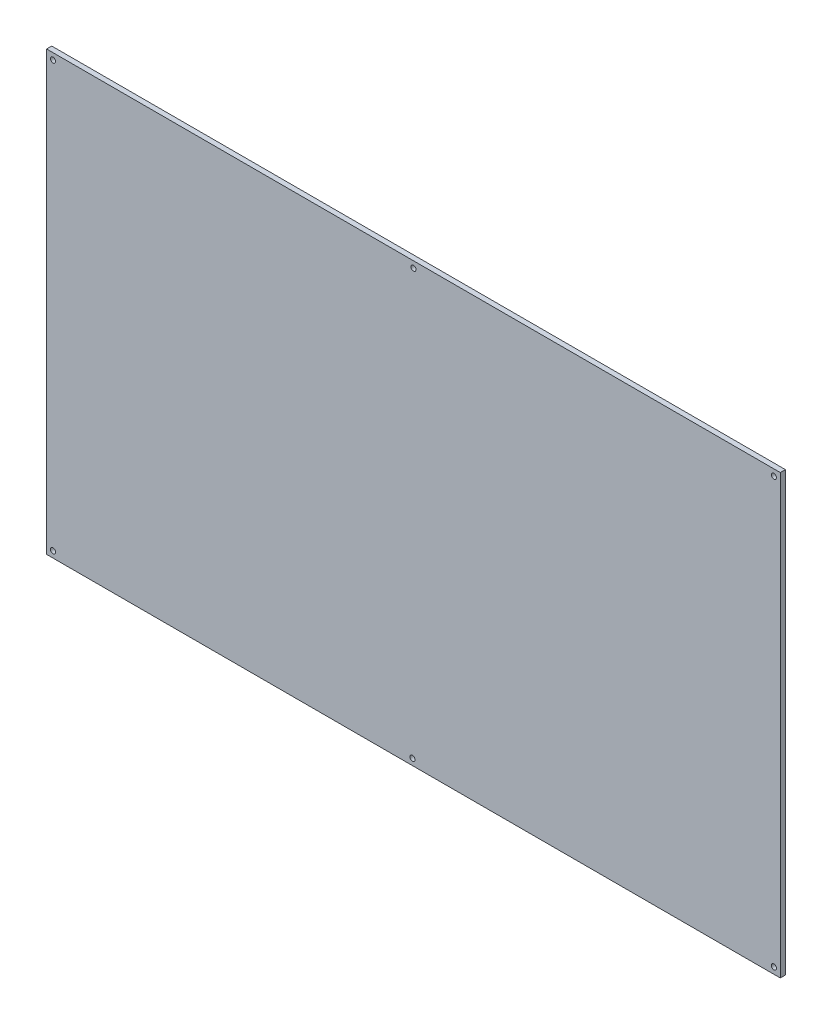
ISO-10303-21;
HEADER;
FILE_DESCRIPTION(('STEP AP214'),'2;1');
FILE_NAME('part.step','',(''),(''),'','','');
FILE_SCHEMA(('AUTOMOTIVE_DESIGN { 1 0 10303 214 1 1 1 1 }'));
ENDSEC;
DATA;
#1=APPLICATION_CONTEXT('core data for automotive mechanical design processes');
#2=APPLICATION_PROTOCOL_DEFINITION('international standard','automotive_design',2000,#1);
#3=PRODUCT_CONTEXT('',#1,'mechanical');
#4=PRODUCT('Part','Part','',(#3));
#5=PRODUCT_RELATED_PRODUCT_CATEGORY('part','',(#4));
#6=PRODUCT_DEFINITION_FORMATION('','',#4);
#7=PRODUCT_DEFINITION_CONTEXT('part definition',#1,'design');
#8=PRODUCT_DEFINITION('design','',#6,#7);
#9=PRODUCT_DEFINITION_SHAPE('','',#8);
#10=(LENGTH_UNIT() NAMED_UNIT(*) SI_UNIT(.MILLI.,.METRE.));
#11=(NAMED_UNIT(*) PLANE_ANGLE_UNIT() SI_UNIT($,.RADIAN.));
#12=(NAMED_UNIT(*) SI_UNIT($,.STERADIAN.) SOLID_ANGLE_UNIT());
#13=UNCERTAINTY_MEASURE_WITH_UNIT(LENGTH_MEASURE(1.E-05),#10,'distance_accuracy_value','');
#14=(GEOMETRIC_REPRESENTATION_CONTEXT(3) GLOBAL_UNCERTAINTY_ASSIGNED_CONTEXT((#13)) GLOBAL_UNIT_ASSIGNED_CONTEXT((#10,
#11,#12)) REPRESENTATION_CONTEXT('',''));
#15=CARTESIAN_POINT('',(0.,0.,0.));
#16=DIRECTION('',(0.,0.,1.));
#17=DIRECTION('',(1.,0.,0.));
#18=AXIS2_PLACEMENT_3D('',#15,#16,#17);
#19=CARTESIAN_POINT('',(0.,0.,2.));
#20=DIRECTION('',(0.,0.,1.));
#21=DIRECTION('',(1.,0.,0.));
#22=AXIS2_PLACEMENT_3D('',#19,#20,#21);
#23=PLANE('',#22);
#24=CARTESIAN_POINT('',(99.6265172378621,16.9859911406423,2.));
#25=DIRECTION('',(0.,0.,1.));
#26=DIRECTION('',(1.,0.,0.));
#27=AXIS2_PLACEMENT_3D('',#24,#25,#26);
#28=CIRCLE('',#27,0.999999999999998);
#29=CARTESIAN_POINT('',(100.626517237862,16.9859911406423,2.));
#30=VERTEX_POINT('',#29);
#31=EDGE_CURVE('E132',#30,#30,#28,.T.);
#32=ORIENTED_EDGE('',*,*,#31,.F.);
#33=EDGE_LOOP('',(#32));
#34=FACE_BOUND('',#33,.T.);
#35=CARTESIAN_POINT('',(240.526517237862,16.9859911406423,2.));
#36=DIRECTION('',(0.,0.,1.));
#37=DIRECTION('',(1.,0.,0.));
#38=AXIS2_PLACEMENT_3D('',#35,#36,#37);
#39=CIRCLE('',#38,0.999999999999998);
#40=CARTESIAN_POINT('',(241.526517237862,16.9859911406423,2.));
#41=VERTEX_POINT('',#40);
#42=EDGE_CURVE('E120',#41,#41,#39,.T.);
#43=ORIENTED_EDGE('',*,*,#42,.F.);
#44=EDGE_LOOP('',(#43));
#45=FACE_BOUND('',#44,.T.);
#46=CARTESIAN_POINT('',(-41.2734827621379,16.9859911406423,2.));
#47=DIRECTION('',(0.,0.,1.));
#48=DIRECTION('',(1.,0.,0.));
#49=AXIS2_PLACEMENT_3D('',#46,#47,#48);
#50=CIRCLE('',#49,0.999999999999998);
#51=CARTESIAN_POINT('',(-40.2734827621379,16.9859911406423,2.));
#52=VERTEX_POINT('',#51);
#53=EDGE_CURVE('E99',#52,#52,#50,.T.);
#54=ORIENTED_EDGE('',*,*,#53,.F.);
#55=EDGE_LOOP('',(#54));
#56=FACE_BOUND('',#55,.T.);
#57=DIRECTION('',(0.,-1.,0.));
#58=VECTOR('',#57,1.);
#59=CARTESIAN_POINT('',(-43.7734827621379,19.4859911406423,2.));
#60=LINE('',#59,#58);
#61=CARTESIAN_POINT('',(-43.7734827621379,19.4859911406423,2.));
#62=VERTEX_POINT('',#61);
#63=CARTESIAN_POINT('',(-43.7734827621379,-151.624008859358,2.));
#64=VERTEX_POINT('',#63);
#65=EDGE_CURVE('E84',#62,#64,#60,.T.);
#66=ORIENTED_EDGE('',*,*,#65,.T.);
#67=DIRECTION('',(1.,0.,0.));
#68=VECTOR('',#67,1.);
#69=CARTESIAN_POINT('',(-43.7734827621379,-151.624008859358,2.));
#70=LINE('',#69,#68);
#71=CARTESIAN_POINT('',(243.026517237862,-151.624008859358,2.));
#72=VERTEX_POINT('',#71);
#73=EDGE_CURVE('E79',#64,#72,#70,.T.);
#74=ORIENTED_EDGE('',*,*,#73,.T.);
#75=DIRECTION('',(0.,1.,0.));
#76=VECTOR('',#75,1.);
#77=CARTESIAN_POINT('',(243.026517237862,19.4859911406423,2.));
#78=LINE('',#77,#76);
#79=CARTESIAN_POINT('',(243.026517237862,19.4859911406423,2.));
#80=VERTEX_POINT('',#79);
#81=EDGE_CURVE('E82',#72,#80,#78,.T.);
#82=ORIENTED_EDGE('',*,*,#81,.T.);
#83=DIRECTION('',(-1.,0.,0.));
#84=VECTOR('',#83,1.);
#85=CARTESIAN_POINT('',(-43.7734827621379,19.4859911406423,2.));
#86=LINE('',#85,#84);
#87=EDGE_CURVE('E49',#80,#62,#86,.T.);
#88=ORIENTED_EDGE('',*,*,#87,.T.);
#89=EDGE_LOOP('',(#66,#74,#82,#88));
#90=FACE_BOUND('',#89,.T.);
#91=CARTESIAN_POINT('',(-41.2734827621379,-149.124008859358,2.));
#92=DIRECTION('',(0.,0.,1.));
#93=DIRECTION('',(1.,0.,0.));
#94=AXIS2_PLACEMENT_3D('',#91,#92,#93);
#95=CIRCLE('',#94,0.999999999999998);
#96=CARTESIAN_POINT('',(-40.2734827621379,-149.124008859358,2.));
#97=VERTEX_POINT('',#96);
#98=EDGE_CURVE('E114',#97,#97,#95,.T.);
#99=ORIENTED_EDGE('',*,*,#98,.F.);
#100=EDGE_LOOP('',(#99));
#101=FACE_BOUND('',#100,.T.);
#102=CARTESIAN_POINT('',(240.526517237862,-149.124008859358,2.));
#103=DIRECTION('',(0.,0.,1.));
#104=DIRECTION('',(1.,0.,0.));
#105=AXIS2_PLACEMENT_3D('',#102,#103,#104);
#106=CIRCLE('',#105,0.999999999999998);
#107=CARTESIAN_POINT('',(241.526517237862,-149.124008859358,2.));
#108=VERTEX_POINT('',#107);
#109=EDGE_CURVE('E126',#108,#108,#106,.T.);
#110=ORIENTED_EDGE('',*,*,#109,.F.);
#111=EDGE_LOOP('',(#110));
#112=FACE_BOUND('',#111,.T.);
#113=CARTESIAN_POINT('',(99.2441033988929,-149.124008859358,2.));
#114=DIRECTION('',(0.,0.,1.));
#115=DIRECTION('',(1.,0.,0.));
#116=AXIS2_PLACEMENT_3D('',#113,#114,#115);
#117=CIRCLE('',#116,0.999999999999998);
#118=CARTESIAN_POINT('',(100.244103398893,-149.124008859358,2.));
#119=VERTEX_POINT('',#118);
#120=EDGE_CURVE('E138',#119,#119,#117,.T.);
#121=ORIENTED_EDGE('',*,*,#120,.F.);
#122=EDGE_LOOP('',(#121));
#123=FACE_BOUND('',#122,.T.);
#124=ADVANCED_FACE('F32',(#34,#45,#56,#90,#101,#112,#123),#23,.T.);
#125=CARTESIAN_POINT('',(0.,0.,0.));
#126=DIRECTION('',(0.,0.,1.));
#127=DIRECTION('',(1.,0.,0.));
#128=AXIS2_PLACEMENT_3D('',#125,#126,#127);
#129=PLANE('',#128);
#130=CARTESIAN_POINT('',(99.6265172378621,16.9859911406423,0.));
#131=DIRECTION('',(0.,0.,1.));
#132=DIRECTION('',(1.,0.,0.));
#133=AXIS2_PLACEMENT_3D('',#130,#131,#132);
#134=CIRCLE('',#133,0.999999999999998);
#135=CARTESIAN_POINT('',(100.626517237862,16.9859911406423,0.));
#136=VERTEX_POINT('',#135);
#137=EDGE_CURVE('E135',#136,#136,#134,.T.);
#138=ORIENTED_EDGE('',*,*,#137,.T.);
#139=EDGE_LOOP('',(#138));
#140=FACE_BOUND('',#139,.T.);
#141=CARTESIAN_POINT('',(240.526517237862,16.9859911406423,0.));
#142=DIRECTION('',(0.,0.,1.));
#143=DIRECTION('',(1.,0.,0.));
#144=AXIS2_PLACEMENT_3D('',#141,#142,#143);
#145=CIRCLE('',#144,0.999999999999998);
#146=CARTESIAN_POINT('',(241.526517237862,16.9859911406423,0.));
#147=VERTEX_POINT('',#146);
#148=EDGE_CURVE('E123',#147,#147,#145,.T.);
#149=ORIENTED_EDGE('',*,*,#148,.T.);
#150=EDGE_LOOP('',(#149));
#151=FACE_BOUND('',#150,.T.);
#152=CARTESIAN_POINT('',(-41.2734827621379,16.9859911406423,0.));
#153=DIRECTION('',(0.,0.,1.));
#154=DIRECTION('',(1.,0.,0.));
#155=AXIS2_PLACEMENT_3D('',#152,#153,#154);
#156=CIRCLE('',#155,0.999999999999998);
#157=CARTESIAN_POINT('',(-40.2734827621379,16.9859911406423,0.));
#158=VERTEX_POINT('',#157);
#159=EDGE_CURVE('E111',#158,#158,#156,.T.);
#160=ORIENTED_EDGE('',*,*,#159,.T.);
#161=EDGE_LOOP('',(#160));
#162=FACE_BOUND('',#161,.T.);
#163=DIRECTION('',(0.,-1.,0.));
#164=VECTOR('',#163,1.);
#165=CARTESIAN_POINT('',(-43.7734827621379,19.4859911406423,0.));
#166=LINE('',#165,#164);
#167=CARTESIAN_POINT('',(-43.7734827621379,19.4859911406423,0.));
#168=VERTEX_POINT('',#167);
#169=CARTESIAN_POINT('',(-43.7734827621379,-151.624008859358,0.));
#170=VERTEX_POINT('',#169);
#171=EDGE_CURVE('E96',#168,#170,#166,.T.);
#172=ORIENTED_EDGE('',*,*,#171,.F.);
#173=DIRECTION('',(-1.,0.,0.));
#174=VECTOR('',#173,1.);
#175=CARTESIAN_POINT('',(-43.7734827621379,19.4859911406423,0.));
#176=LINE('',#175,#174);
#177=CARTESIAN_POINT('',(243.026517237862,19.4859911406423,0.));
#178=VERTEX_POINT('',#177);
#179=EDGE_CURVE('E72',#178,#168,#176,.T.);
#180=ORIENTED_EDGE('',*,*,#179,.F.);
#181=DIRECTION('',(0.,1.,0.));
#182=VECTOR('',#181,1.);
#183=CARTESIAN_POINT('',(243.026517237862,19.4859911406423,0.));
#184=LINE('',#183,#182);
#185=CARTESIAN_POINT('',(243.026517237862,-151.624008859358,0.));
#186=VERTEX_POINT('',#185);
#187=EDGE_CURVE('E66',#186,#178,#184,.T.);
#188=ORIENTED_EDGE('',*,*,#187,.F.);
#189=DIRECTION('',(1.,0.,0.));
#190=VECTOR('',#189,1.);
#191=CARTESIAN_POINT('',(-43.7734827621379,-151.624008859358,0.));
#192=LINE('',#191,#190);
#193=EDGE_CURVE('E88',#170,#186,#192,.T.);
#194=ORIENTED_EDGE('',*,*,#193,.F.);
#195=EDGE_LOOP('',(#172,#180,#188,#194));
#196=FACE_BOUND('',#195,.T.);
#197=CARTESIAN_POINT('',(-41.2734827621379,-149.124008859358,0.));
#198=DIRECTION('',(0.,0.,1.));
#199=DIRECTION('',(1.,0.,0.));
#200=AXIS2_PLACEMENT_3D('',#197,#198,#199);
#201=CIRCLE('',#200,0.999999999999998);
#202=CARTESIAN_POINT('',(-40.2734827621379,-149.124008859358,0.));
#203=VERTEX_POINT('',#202);
#204=EDGE_CURVE('E117',#203,#203,#201,.T.);
#205=ORIENTED_EDGE('',*,*,#204,.T.);
#206=EDGE_LOOP('',(#205));
#207=FACE_BOUND('',#206,.T.);
#208=CARTESIAN_POINT('',(240.526517237862,-149.124008859358,0.));
#209=DIRECTION('',(0.,0.,1.));
#210=DIRECTION('',(1.,0.,0.));
#211=AXIS2_PLACEMENT_3D('',#208,#209,#210);
#212=CIRCLE('',#211,0.999999999999998);
#213=CARTESIAN_POINT('',(241.526517237862,-149.124008859358,0.));
#214=VERTEX_POINT('',#213);
#215=EDGE_CURVE('E129',#214,#214,#212,.T.);
#216=ORIENTED_EDGE('',*,*,#215,.T.);
#217=EDGE_LOOP('',(#216));
#218=FACE_BOUND('',#217,.T.);
#219=CARTESIAN_POINT('',(99.2441033988929,-149.124008859358,0.));
#220=DIRECTION('',(0.,0.,1.));
#221=DIRECTION('',(1.,0.,0.));
#222=AXIS2_PLACEMENT_3D('',#219,#220,#221);
#223=CIRCLE('',#222,0.999999999999998);
#224=CARTESIAN_POINT('',(100.244103398893,-149.124008859358,0.));
#225=VERTEX_POINT('',#224);
#226=EDGE_CURVE('E141',#225,#225,#223,.T.);
#227=ORIENTED_EDGE('',*,*,#226,.T.);
#228=EDGE_LOOP('',(#227));
#229=FACE_BOUND('',#228,.T.);
#230=ADVANCED_FACE('F107',(#140,#151,#162,#196,#207,#218,#229),#129,.F.);
#231=CARTESIAN_POINT('',(-43.7734827621379,19.4859911406423,2.));
#232=DIRECTION('',(1.,0.,0.));
#233=DIRECTION('',(0.,1.,0.));
#234=AXIS2_PLACEMENT_3D('',#231,#232,#233);
#235=PLANE('',#234);
#236=ORIENTED_EDGE('',*,*,#171,.T.);
#237=DIRECTION('',(0.,0.,-1.));
#238=VECTOR('',#237,1.);
#239=CARTESIAN_POINT('',(-43.7734827621379,-151.624008859358,2.));
#240=LINE('',#239,#238);
#241=EDGE_CURVE('E11',#64,#170,#240,.T.);
#242=ORIENTED_EDGE('',*,*,#241,.F.);
#243=ORIENTED_EDGE('',*,*,#65,.F.);
#244=DIRECTION('',(0.,0.,-1.));
#245=VECTOR('',#244,1.);
#246=CARTESIAN_POINT('',(-43.7734827621379,19.4859911406423,2.));
#247=LINE('',#246,#245);
#248=EDGE_CURVE('E92',#62,#168,#247,.T.);
#249=ORIENTED_EDGE('',*,*,#248,.T.);
#250=EDGE_LOOP('',(#236,#242,#243,#249));
#251=FACE_BOUND('',#250,.T.);
#252=ADVANCED_FACE('F34',(#251),#235,.F.);
#253=CARTESIAN_POINT('',(-43.7734827621379,-151.624008859358,2.));
#254=DIRECTION('',(0.,1.,0.));
#255=DIRECTION('',(0.,0.,1.));
#256=AXIS2_PLACEMENT_3D('',#253,#254,#255);
#257=PLANE('',#256);
#258=ORIENTED_EDGE('',*,*,#193,.T.);
#259=DIRECTION('',(0.,0.,-1.));
#260=VECTOR('',#259,1.);
#261=CARTESIAN_POINT('',(243.026517237862,-151.624008859358,2.));
#262=LINE('',#261,#260);
#263=EDGE_CURVE('E41',#72,#186,#262,.T.);
#264=ORIENTED_EDGE('',*,*,#263,.F.);
#265=ORIENTED_EDGE('',*,*,#73,.F.);
#266=ORIENTED_EDGE('',*,*,#241,.T.);
#267=EDGE_LOOP('',(#258,#264,#265,#266));
#268=FACE_BOUND('',#267,.T.);
#269=ADVANCED_FACE('F87',(#268),#257,.F.);
#270=CARTESIAN_POINT('',(243.026517237862,19.4859911406423,2.));
#271=DIRECTION('',(-1.,0.,0.));
#272=DIRECTION('',(0.,-1.,0.));
#273=AXIS2_PLACEMENT_3D('',#270,#271,#272);
#274=PLANE('',#273);
#275=ORIENTED_EDGE('',*,*,#187,.T.);
#276=DIRECTION('',(0.,0.,-1.));
#277=VECTOR('',#276,1.);
#278=CARTESIAN_POINT('',(243.026517237862,19.4859911406423,2.));
#279=LINE('',#278,#277);
#280=EDGE_CURVE('E89',#80,#178,#279,.T.);
#281=ORIENTED_EDGE('',*,*,#280,.F.);
#282=ORIENTED_EDGE('',*,*,#81,.F.);
#283=ORIENTED_EDGE('',*,*,#263,.T.);
#284=EDGE_LOOP('',(#275,#281,#282,#283));
#285=FACE_BOUND('',#284,.T.);
#286=ADVANCED_FACE('F90',(#285),#274,.F.);
#287=CARTESIAN_POINT('',(-43.7734827621379,19.4859911406423,2.));
#288=DIRECTION('',(0.,-1.,0.));
#289=DIRECTION('',(0.,0.,-1.));
#290=AXIS2_PLACEMENT_3D('',#287,#288,#289);
#291=PLANE('',#290);
#292=ORIENTED_EDGE('',*,*,#179,.T.);
#293=ORIENTED_EDGE('',*,*,#248,.F.);
#294=ORIENTED_EDGE('',*,*,#87,.F.);
#295=ORIENTED_EDGE('',*,*,#280,.T.);
#296=EDGE_LOOP('',(#292,#293,#294,#295));
#297=FACE_BOUND('',#296,.T.);
#298=ADVANCED_FACE('F104',(#297),#291,.F.);
#299=CARTESIAN_POINT('',(-41.2734827621379,16.9859911406423,2.));
#300=DIRECTION('',(0.,0.,-1.));
#301=DIRECTION('',(-1.,0.,0.));
#302=AXIS2_PLACEMENT_3D('',#299,#300,#301);
#303=CYLINDRICAL_SURFACE('',#302,0.999999999999998);
#304=ORIENTED_EDGE('',*,*,#53,.T.);
#305=EDGE_LOOP('',(#304));
#306=FACE_BOUND('',#305,.T.);
#307=ORIENTED_EDGE('',*,*,#159,.F.);
#308=EDGE_LOOP('',(#307));
#309=FACE_BOUND('',#308,.T.);
#310=ADVANCED_FACE('F161',(#306,#309),#303,.F.);
#311=CARTESIAN_POINT('',(-41.2734827621379,-149.124008859358,2.));
#312=DIRECTION('',(0.,0.,-1.));
#313=DIRECTION('',(-1.,0.,0.));
#314=AXIS2_PLACEMENT_3D('',#311,#312,#313);
#315=CYLINDRICAL_SURFACE('',#314,0.999999999999998);
#316=ORIENTED_EDGE('',*,*,#98,.T.);
#317=EDGE_LOOP('',(#316));
#318=FACE_BOUND('',#317,.T.);
#319=ORIENTED_EDGE('',*,*,#204,.F.);
#320=EDGE_LOOP('',(#319));
#321=FACE_BOUND('',#320,.T.);
#322=ADVANCED_FACE('F207',(#318,#321),#315,.F.);
#323=CARTESIAN_POINT('',(240.526517237862,16.9859911406423,2.));
#324=DIRECTION('',(0.,0.,-1.));
#325=DIRECTION('',(-1.,0.,0.));
#326=AXIS2_PLACEMENT_3D('',#323,#324,#325);
#327=CYLINDRICAL_SURFACE('',#326,0.999999999999998);
#328=ORIENTED_EDGE('',*,*,#42,.T.);
#329=EDGE_LOOP('',(#328));
#330=FACE_BOUND('',#329,.T.);
#331=ORIENTED_EDGE('',*,*,#148,.F.);
#332=EDGE_LOOP('',(#331));
#333=FACE_BOUND('',#332,.T.);
#334=ADVANCED_FACE('F215',(#330,#333),#327,.F.);
#335=CARTESIAN_POINT('',(240.526517237862,-149.124008859358,2.));
#336=DIRECTION('',(0.,0.,-1.));
#337=DIRECTION('',(-1.,0.,0.));
#338=AXIS2_PLACEMENT_3D('',#335,#336,#337);
#339=CYLINDRICAL_SURFACE('',#338,0.999999999999998);
#340=ORIENTED_EDGE('',*,*,#109,.T.);
#341=EDGE_LOOP('',(#340));
#342=FACE_BOUND('',#341,.T.);
#343=ORIENTED_EDGE('',*,*,#215,.F.);
#344=EDGE_LOOP('',(#343));
#345=FACE_BOUND('',#344,.T.);
#346=ADVANCED_FACE('F223',(#342,#345),#339,.F.);
#347=CARTESIAN_POINT('',(99.6265172378621,16.9859911406423,2.));
#348=DIRECTION('',(0.,0.,-1.));
#349=DIRECTION('',(-1.,0.,0.));
#350=AXIS2_PLACEMENT_3D('',#347,#348,#349);
#351=CYLINDRICAL_SURFACE('',#350,0.999999999999998);
#352=ORIENTED_EDGE('',*,*,#31,.T.);
#353=EDGE_LOOP('',(#352));
#354=FACE_BOUND('',#353,.T.);
#355=ORIENTED_EDGE('',*,*,#137,.F.);
#356=EDGE_LOOP('',(#355));
#357=FACE_BOUND('',#356,.T.);
#358=ADVANCED_FACE('F232',(#354,#357),#351,.F.);
#359=CARTESIAN_POINT('',(99.2441033988929,-149.124008859358,2.));
#360=DIRECTION('',(0.,0.,-1.));
#361=DIRECTION('',(-1.,0.,0.));
#362=AXIS2_PLACEMENT_3D('',#359,#360,#361);
#363=CYLINDRICAL_SURFACE('',#362,0.999999999999998);
#364=ORIENTED_EDGE('',*,*,#120,.T.);
#365=EDGE_LOOP('',(#364));
#366=FACE_BOUND('',#365,.T.);
#367=ORIENTED_EDGE('',*,*,#226,.F.);
#368=EDGE_LOOP('',(#367));
#369=FACE_BOUND('',#368,.T.);
#370=ADVANCED_FACE('F147',(#366,#369),#363,.F.);
#371=CLOSED_SHELL('',(#124,#230,#252,#269,#286,#298,#310,#322,#334,#346,#358,#370));
#372=MANIFOLD_SOLID_BREP('B2',#371);
#373=ADVANCED_BREP_SHAPE_REPRESENTATION('',(#18,#372),#14);
#374=SHAPE_DEFINITION_REPRESENTATION(#9,#373);
ENDSEC;
END-ISO-10303-21;
